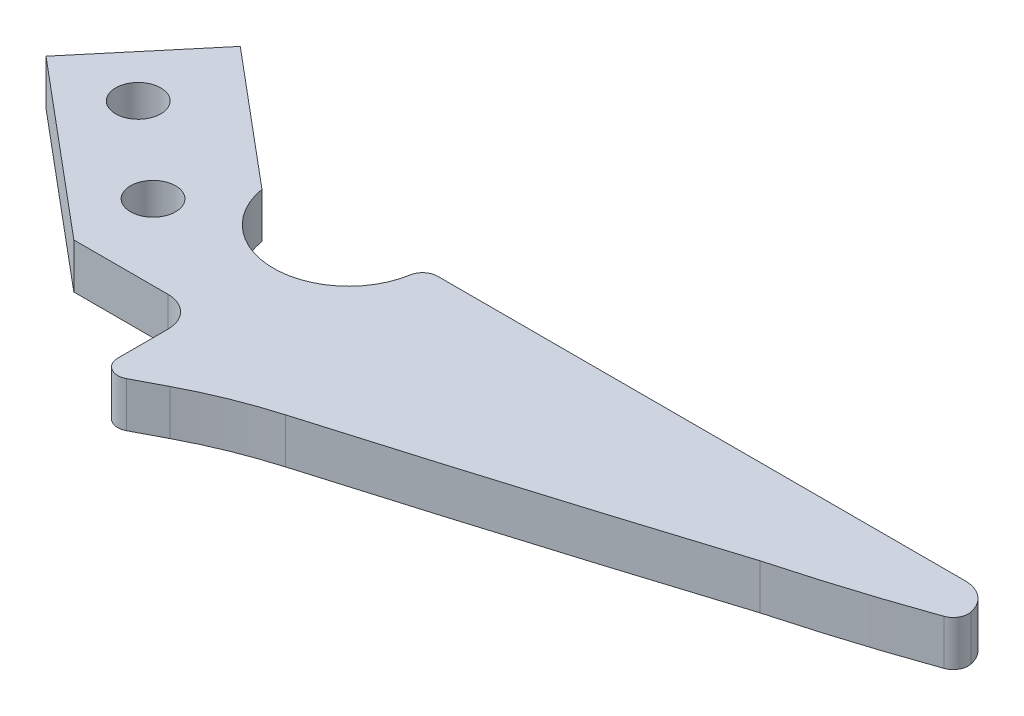
ISO-10303-21;
HEADER;
FILE_DESCRIPTION(('STEP AP214'),'2;1');
FILE_NAME('part.step','',(''),(''),'','','');
FILE_SCHEMA(('AUTOMOTIVE_DESIGN { 1 0 10303 214 1 1 1 1 }'));
ENDSEC;
DATA;
#1=APPLICATION_CONTEXT('core data for automotive mechanical design processes');
#2=APPLICATION_PROTOCOL_DEFINITION('international standard','automotive_design',2000,#1);
#3=PRODUCT_CONTEXT('',#1,'mechanical');
#4=PRODUCT('Part','Part','',(#3));
#5=PRODUCT_RELATED_PRODUCT_CATEGORY('part','',(#4));
#6=PRODUCT_DEFINITION_FORMATION('','',#4);
#7=PRODUCT_DEFINITION_CONTEXT('part definition',#1,'design');
#8=PRODUCT_DEFINITION('design','',#6,#7);
#9=PRODUCT_DEFINITION_SHAPE('','',#8);
#10=(LENGTH_UNIT() NAMED_UNIT(*) SI_UNIT(.MILLI.,.METRE.));
#11=(NAMED_UNIT(*) PLANE_ANGLE_UNIT() SI_UNIT($,.RADIAN.));
#12=(NAMED_UNIT(*) SI_UNIT($,.STERADIAN.) SOLID_ANGLE_UNIT());
#13=UNCERTAINTY_MEASURE_WITH_UNIT(LENGTH_MEASURE(1.E-05),#10,'distance_accuracy_value','');
#14=(GEOMETRIC_REPRESENTATION_CONTEXT(3) GLOBAL_UNCERTAINTY_ASSIGNED_CONTEXT((#13)) GLOBAL_UNIT_ASSIGNED_CONTEXT((#10,
#11,#12)) REPRESENTATION_CONTEXT('',''));
#15=CARTESIAN_POINT('',(0.,0.,0.));
#16=DIRECTION('',(0.,0.,1.));
#17=DIRECTION('',(1.,0.,0.));
#18=AXIS2_PLACEMENT_3D('',#15,#16,#17);
#19=CARTESIAN_POINT('',(13.,0.,5.34819795369593));
#20=DIRECTION('',(0.,1.,0.));
#21=DIRECTION('',(0.,0.,1.));
#22=AXIS2_PLACEMENT_3D('',#19,#20,#21);
#23=CYLINDRICAL_SURFACE('',#22,1.);
#24=DIRECTION('',(0.,1.,0.));
#25=VECTOR('',#24,1.);
#26=CARTESIAN_POINT('',(13.4635840631076,0.,6.23425089592493));
#27=LINE('',#26,#25);
#28=CARTESIAN_POINT('',(13.4635840631076,3.,6.23425089592493));
#29=VERTEX_POINT('',#28);
#30=CARTESIAN_POINT('',(13.4635840631076,0.,6.23425089592493));
#31=VERTEX_POINT('',#30);
#32=EDGE_CURVE('E210',#29,#31,#27,.F.);
#33=ORIENTED_EDGE('',*,*,#32,.F.);
#34=CARTESIAN_POINT('',(13.,3.,5.34819795369593));
#35=DIRECTION('',(0.,1.,0.));
#36=DIRECTION('',(0.,0.,1.));
#37=AXIS2_PLACEMENT_3D('',#34,#35,#36);
#38=CIRCLE('',#37,1.);
#39=CARTESIAN_POINT('',(12.,3.,5.34819795369593));
#40=VERTEX_POINT('',#39);
#41=EDGE_CURVE('E145',#40,#29,#38,.T.);
#42=ORIENTED_EDGE('',*,*,#41,.F.);
#43=DIRECTION('',(0.,1.,0.));
#44=VECTOR('',#43,1.);
#45=CARTESIAN_POINT('',(12.,0.,5.34819795369593));
#46=LINE('',#45,#44);
#47=CARTESIAN_POINT('',(12.,0.,5.34819795369593));
#48=VERTEX_POINT('',#47);
#49=EDGE_CURVE('E144',#48,#40,#46,.T.);
#50=ORIENTED_EDGE('',*,*,#49,.F.);
#51=CARTESIAN_POINT('',(13.,0.,5.34819795369593));
#52=DIRECTION('',(0.,1.,0.));
#53=DIRECTION('',(0.,0.,1.));
#54=AXIS2_PLACEMENT_3D('',#51,#52,#53);
#55=CIRCLE('',#54,1.);
#56=EDGE_CURVE('E20',#48,#31,#55,.T.);
#57=ORIENTED_EDGE('',*,*,#56,.T.);
#58=EDGE_LOOP('',(#33,#42,#50,#57));
#59=FACE_BOUND('',#58,.T.);
#60=ADVANCED_FACE('F17',(#59),#23,.T.);
#61=CARTESIAN_POINT('',(53.980656682762,0.,-8.19573571608667));
#62=DIRECTION('',(0.,1.,0.));
#63=DIRECTION('',(0.,0.,1.));
#64=AXIS2_PLACEMENT_3D('',#61,#62,#63);
#65=CYLINDRICAL_SURFACE('',#64,1.);
#66=CARTESIAN_POINT('',(53.980656682762,3.,-8.19573571608667));
#67=DIRECTION('',(0.,1.,0.));
#68=DIRECTION('',(0.,0.,1.));
#69=AXIS2_PLACEMENT_3D('',#66,#67,#68);
#70=CIRCLE('',#69,1.);
#71=CARTESIAN_POINT('',(54.3167919613056,3.,-7.25392200068515));
#72=VERTEX_POINT('',#71);
#73=CARTESIAN_POINT('',(54.9613133655257,3.,-8.39147143217367));
#74=VERTEX_POINT('',#73);
#75=EDGE_CURVE('E280',#72,#74,#70,.T.);
#76=ORIENTED_EDGE('',*,*,#75,.F.);
#77=DIRECTION('',(0.,1.,0.));
#78=VECTOR('',#77,1.);
#79=CARTESIAN_POINT('',(54.3167919613056,0.,-7.25392200068516));
#80=LINE('',#79,#78);
#81=CARTESIAN_POINT('',(54.3167919613056,0.,-7.25392200068515));
#82=VERTEX_POINT('',#81);
#83=EDGE_CURVE('E201',#82,#72,#80,.T.);
#84=ORIENTED_EDGE('',*,*,#83,.F.);
#85=CARTESIAN_POINT('',(53.980656682762,0.,-8.19573571608667));
#86=DIRECTION('',(0.,1.,0.));
#87=DIRECTION('',(0.,0.,1.));
#88=AXIS2_PLACEMENT_3D('',#85,#86,#87);
#89=CIRCLE('',#88,1.);
#90=CARTESIAN_POINT('',(54.9613133655257,0.,-8.39147143217367));
#91=VERTEX_POINT('',#90);
#92=EDGE_CURVE('E142',#82,#91,#89,.T.);
#93=ORIENTED_EDGE('',*,*,#92,.T.);
#94=DIRECTION('',(0.,1.,0.));
#95=VECTOR('',#94,1.);
#96=CARTESIAN_POINT('',(54.9613133655262,0.,-8.39147143217378));
#97=LINE('',#96,#95);
#98=EDGE_CURVE('E194',#74,#91,#97,.F.);
#99=ORIENTED_EDGE('',*,*,#98,.F.);
#100=EDGE_LOOP('',(#76,#84,#93,#99));
#101=FACE_BOUND('',#100,.T.);
#102=ADVANCED_FACE('F288',(#101),#65,.T.);
#103=CARTESIAN_POINT('',(17.9160797830996,0.,-9.00000000000001));
#104=DIRECTION('',(0.,1.,0.));
#105=DIRECTION('',(0.,0.,1.));
#106=AXIS2_PLACEMENT_3D('',#103,#104,#105);
#107=CYLINDRICAL_SURFACE('',#106,0.999999999999999);
#108=CARTESIAN_POINT('',(17.9160797830996,0.,-9.00000000000001));
#109=DIRECTION('',(0.,1.,0.));
#110=DIRECTION('',(0.,0.,1.));
#111=AXIS2_PLACEMENT_3D('',#108,#109,#110);
#112=CIRCLE('',#111,0.999999999999999);
#113=CARTESIAN_POINT('',(17.9160797830996,0.,-10.));
#114=VERTEX_POINT('',#113);
#115=CARTESIAN_POINT('',(16.9300664859163,0.,-9.16666666666667));
#116=VERTEX_POINT('',#115);
#117=EDGE_CURVE('E283',#114,#116,#112,.T.);
#118=ORIENTED_EDGE('',*,*,#117,.T.);
#119=DIRECTION('',(0.,1.,0.));
#120=VECTOR('',#119,1.);
#121=CARTESIAN_POINT('',(16.9300664859163,0.,-9.16666666666667));
#122=LINE('',#121,#120);
#123=CARTESIAN_POINT('',(16.9300664859163,3.,-9.16666666666667));
#124=VERTEX_POINT('',#123);
#125=EDGE_CURVE('E184',#116,#124,#122,.T.);
#126=ORIENTED_EDGE('',*,*,#125,.T.);
#127=CARTESIAN_POINT('',(17.9160797830996,3.,-9.00000000000001));
#128=DIRECTION('',(0.,1.,0.));
#129=DIRECTION('',(0.,0.,1.));
#130=AXIS2_PLACEMENT_3D('',#127,#128,#129);
#131=CIRCLE('',#130,0.999999999999999);
#132=CARTESIAN_POINT('',(17.9160797830996,3.,-10.));
#133=VERTEX_POINT('',#132);
#134=EDGE_CURVE('E277',#133,#124,#131,.T.);
#135=ORIENTED_EDGE('',*,*,#134,.F.);
#136=DIRECTION('',(0.,1.,0.));
#137=VECTOR('',#136,1.);
#138=CARTESIAN_POINT('',(17.9160797830996,0.,-10.));
#139=LINE('',#138,#137);
#140=EDGE_CURVE('E188',#114,#133,#139,.T.);
#141=ORIENTED_EDGE('',*,*,#140,.F.);
#142=EDGE_LOOP('',(#118,#126,#135,#141));
#143=FACE_BOUND('',#142,.T.);
#144=ADVANCED_FACE('F376',(#143),#107,.T.);
#145=CARTESIAN_POINT('',(12.2998821433564,3.,-124.980636425876));
#146=DIRECTION('',(0.,1.,0.));
#147=DIRECTION('',(0.,0.,1.));
#148=AXIS2_PLACEMENT_3D('',#145,#146,#147);
#149=PLANE('',#148);
#150=CARTESIAN_POINT('',(4.,3.,-5.));
#151=DIRECTION('',(0.,1.,0.));
#152=DIRECTION('',(0.,0.,1.));
#153=AXIS2_PLACEMENT_3D('',#150,#151,#152);
#154=CIRCLE('',#153,1.5);
#155=CARTESIAN_POINT('',(4.,3.,-3.5));
#156=VERTEX_POINT('',#155);
#157=EDGE_CURVE('E225',#156,#156,#154,.F.);
#158=ORIENTED_EDGE('',*,*,#157,.T.);
#159=EDGE_LOOP('',(#158));
#160=FACE_BOUND('',#159,.T.);
#161=CARTESIAN_POINT('',(12.,3.,-10.));
#162=DIRECTION('',(0.,1.,0.));
#163=DIRECTION('',(0.,0.,1.));
#164=AXIS2_PLACEMENT_3D('',#161,#162,#163);
#165=CIRCLE('',#164,5.);
#166=CARTESIAN_POINT('',(7.06993351408365,3.,-9.16666666666667));
#167=VERTEX_POINT('',#166);
#168=EDGE_CURVE('E187',#124,#167,#165,.F.);
#169=ORIENTED_EDGE('',*,*,#168,.T.);
#170=DIRECTION('',(-0.766044443118997,0.,-0.642787609686517));
#171=VECTOR('',#170,1.);
#172=CARTESIAN_POINT('',(7.06993351408365,3.,-9.16666666666667));
#173=LINE('',#172,#171);
#174=CARTESIAN_POINT('',(-1.8724279217503,3.,-16.6701988493284));
#175=VERTEX_POINT('',#174);
#176=EDGE_CURVE('E174',#175,#167,#173,.F.);
#177=ORIENTED_EDGE('',*,*,#176,.F.);
#178=DIRECTION('',(-0.642787609686517,0.,0.766044443118997));
#179=VECTOR('',#178,1.);
#180=CARTESIAN_POINT('',(-1.8724279217503,3.,-16.6701988493284));
#181=LINE('',#180,#179);
#182=CARTESIAN_POINT('',(-7.76368375617389,3.,-9.6492735437621));
#183=VERTEX_POINT('',#182);
#184=EDGE_CURVE('E181',#183,#175,#181,.F.);
#185=ORIENTED_EDGE('',*,*,#184,.F.);
#186=DIRECTION('',(-0.766044443118997,0.,-0.642787609686517));
#187=VECTOR('',#186,1.);
#188=CARTESIAN_POINT('',(3.73587265552954,3.,0.));
#189=LINE('',#188,#187);
#190=CARTESIAN_POINT('',(3.73587265552957,3.,0.));
#191=VERTEX_POINT('',#190);
#192=EDGE_CURVE('E168',#183,#191,#189,.F.);
#193=ORIENTED_EDGE('',*,*,#192,.T.);
#194=DIRECTION('',(1.,0.,0.));
#195=VECTOR('',#194,1.);
#196=CARTESIAN_POINT('',(-8.,3.,0.));
#197=LINE('',#196,#195);
#198=CARTESIAN_POINT('',(9.99999999999999,3.,0.));
#199=VERTEX_POINT('',#198);
#200=EDGE_CURVE('E217',#199,#191,#197,.F.);
#201=ORIENTED_EDGE('',*,*,#200,.F.);
#202=CARTESIAN_POINT('',(9.99999999999999,3.,2.));
#203=DIRECTION('',(0.,-1.,0.));
#204=DIRECTION('',(0.,0.,-1.));
#205=AXIS2_PLACEMENT_3D('',#202,#203,#204);
#206=CIRCLE('',#205,2.);
#207=CARTESIAN_POINT('',(12.,3.,2.));
#208=VERTEX_POINT('',#207);
#209=EDGE_CURVE('E149',#199,#208,#206,.T.);
#210=ORIENTED_EDGE('',*,*,#209,.T.);
#211=DIRECTION('',(0.,0.,1.));
#212=VECTOR('',#211,1.);
#213=CARTESIAN_POINT('',(12.,3.,0.));
#214=LINE('',#213,#212);
#215=EDGE_CURVE('E148',#40,#208,#214,.F.);
#216=ORIENTED_EDGE('',*,*,#215,.F.);
#217=ORIENTED_EDGE('',*,*,#41,.T.);
#218=DIRECTION('',(0.886052942228994,0.,-0.463584063107591));
#219=VECTOR('',#218,1.);
#220=CARTESIAN_POINT('',(12.,3.,7.));
#221=LINE('',#220,#219);
#222=CARTESIAN_POINT('',(15.3611622163812,3.,5.24143551387112));
#223=VERTEX_POINT('',#222);
#224=EDGE_CURVE('E212',#223,#29,#221,.F.);
#225=ORIENTED_EDGE('',*,*,#224,.F.);
#226=CARTESIAN_POINT('',(29.2686841096088,3.,31.8230237807408));
#227=DIRECTION('',(0.,1.,0.));
#228=DIRECTION('',(0.,0.,1.));
#229=AXIS2_PLACEMENT_3D('',#226,#227,#228);
#230=CIRCLE('',#229,30.);
#231=CARTESIAN_POINT('',(20.8237073802902,3.,3.03618011837881));
#232=VERTEX_POINT('',#231);
#233=EDGE_CURVE('E209',#223,#232,#230,.F.);
#234=ORIENTED_EDGE('',*,*,#233,.T.);
#235=CARTESIAN_POINT('',(-316.975361792386,3.,-1148.43756637586));
#236=DIRECTION('',(0.,1.,0.));
#237=DIRECTION('',(0.,0.,1.));
#238=AXIS2_PLACEMENT_3D('',#235,#236,#237);
#239=CIRCLE('',#238,1199.99999999976);
#240=CARTESIAN_POINT('',(45.0000000000018,3.,-4.33362116166966));
#241=VERTEX_POINT('',#240);
#242=EDGE_CURVE('E205',#241,#232,#239,.F.);
#243=ORIENTED_EDGE('',*,*,#242,.F.);
#244=CARTESIAN_POINT('',(12.2998821433564,3.,-124.980636425876));
#245=DIRECTION('',(0.,1.,0.));
#246=DIRECTION('',(0.,0.,1.));
#247=AXIS2_PLACEMENT_3D('',#244,#245,#246);
#248=CIRCLE('',#247,125.);
#249=EDGE_CURVE('E200',#72,#241,#248,.F.);
#250=ORIENTED_EDGE('',*,*,#249,.F.);
#251=ORIENTED_EDGE('',*,*,#75,.T.);
#252=CARTESIAN_POINT('',(53.,3.,-8.));
#253=DIRECTION('',(0.,1.,0.));
#254=DIRECTION('',(0.,0.,1.));
#255=AXIS2_PLACEMENT_3D('',#252,#253,#254);
#256=CIRCLE('',#255,2.);
#257=CARTESIAN_POINT('',(53.,3.,-10.));
#258=VERTEX_POINT('',#257);
#259=EDGE_CURVE('E197',#258,#74,#256,.F.);
#260=ORIENTED_EDGE('',*,*,#259,.F.);
#261=DIRECTION('',(-1.,0.,0.));
#262=VECTOR('',#261,1.);
#263=CARTESIAN_POINT('',(53.,3.,-10.));
#264=LINE('',#263,#262);
#265=EDGE_CURVE('E191',#133,#258,#264,.F.);
#266=ORIENTED_EDGE('',*,*,#265,.F.);
#267=ORIENTED_EDGE('',*,*,#134,.T.);
#268=EDGE_LOOP('',(#169,#177,#185,#193,#201,#210,#216,#217,#225,#234,#243,#250,#251,#260,#266,#267));
#269=FACE_BOUND('',#268,.T.);
#270=CARTESIAN_POINT('',(-2.12835554495197,3.,-10.1423008774921));
#271=DIRECTION('',(0.,-1.,0.));
#272=DIRECTION('',(0.,0.,-1.));
#273=AXIS2_PLACEMENT_3D('',#270,#271,#272);
#274=CIRCLE('',#273,1.5);
#275=CARTESIAN_POINT('',(-2.12835554495197,3.,-11.6423008774921));
#276=VERTEX_POINT('',#275);
#277=EDGE_CURVE('E274',#276,#276,#274,.T.);
#278=ORIENTED_EDGE('',*,*,#277,.T.);
#279=EDGE_LOOP('',(#278));
#280=FACE_BOUND('',#279,.T.);
#281=ADVANCED_FACE('F312',(#160,#269,#280),#149,.T.);
#282=CARTESIAN_POINT('',(-2.12835554495197,3.,-10.1423008774921));
#283=DIRECTION('',(0.,-1.,0.));
#284=DIRECTION('',(0.,0.,-1.));
#285=AXIS2_PLACEMENT_3D('',#282,#283,#284);
#286=CYLINDRICAL_SURFACE('',#285,1.5);
#287=ORIENTED_EDGE('',*,*,#277,.F.);
#288=EDGE_LOOP('',(#287));
#289=FACE_BOUND('',#288,.T.);
#290=CARTESIAN_POINT('',(-2.12835554495197,0.,-10.1423008774921));
#291=DIRECTION('',(0.,-1.,0.));
#292=DIRECTION('',(0.,0.,-1.));
#293=AXIS2_PLACEMENT_3D('',#290,#291,#292);
#294=CIRCLE('',#293,1.5);
#295=CARTESIAN_POINT('',(-2.12835554495197,0.,-11.6423008774921));
#296=VERTEX_POINT('',#295);
#297=EDGE_CURVE('E230',#296,#296,#294,.T.);
#298=ORIENTED_EDGE('',*,*,#297,.T.);
#299=EDGE_LOOP('',(#298));
#300=FACE_BOUND('',#299,.T.);
#301=ADVANCED_FACE('F384',(#289,#300),#286,.F.);
#302=CARTESIAN_POINT('',(4.,0.,-5.));
#303=DIRECTION('',(0.,1.,0.));
#304=DIRECTION('',(0.,0.,1.));
#305=AXIS2_PLACEMENT_3D('',#302,#303,#304);
#306=CYLINDRICAL_SURFACE('',#305,1.5);
#307=CARTESIAN_POINT('',(4.,0.,-5.));
#308=DIRECTION('',(0.,1.,0.));
#309=DIRECTION('',(0.,0.,1.));
#310=AXIS2_PLACEMENT_3D('',#307,#308,#309);
#311=CIRCLE('',#310,1.5);
#312=CARTESIAN_POINT('',(4.,0.,-3.5));
#313=VERTEX_POINT('',#312);
#314=EDGE_CURVE('E164',#313,#313,#311,.F.);
#315=ORIENTED_EDGE('',*,*,#314,.T.);
#316=EDGE_LOOP('',(#315));
#317=FACE_BOUND('',#316,.T.);
#318=ORIENTED_EDGE('',*,*,#157,.F.);
#319=EDGE_LOOP('',(#318));
#320=FACE_BOUND('',#319,.T.);
#321=ADVANCED_FACE('F330',(#317,#320),#306,.F.);
#322=CARTESIAN_POINT('',(-8.,0.,0.));
#323=DIRECTION('',(0.,0.,1.));
#324=DIRECTION('',(1.,0.,0.));
#325=AXIS2_PLACEMENT_3D('',#322,#323,#324);
#326=PLANE('',#325);
#327=DIRECTION('',(0.,-1.,0.));
#328=VECTOR('',#327,1.);
#329=CARTESIAN_POINT('',(9.99999999999999,0.,0.));
#330=LINE('',#329,#328);
#331=CARTESIAN_POINT('',(9.99999999999999,0.,0.));
#332=VERTEX_POINT('',#331);
#333=EDGE_CURVE('E214',#332,#199,#330,.F.);
#334=ORIENTED_EDGE('',*,*,#333,.T.);
#335=ORIENTED_EDGE('',*,*,#200,.T.);
#336=DIRECTION('',(0.,1.,0.));
#337=VECTOR('',#336,1.);
#338=CARTESIAN_POINT('',(3.73587265552956,3.,0.));
#339=LINE('',#338,#337);
#340=CARTESIAN_POINT('',(3.73587265552956,0.,0.));
#341=VERTEX_POINT('',#340);
#342=EDGE_CURVE('E169',#191,#341,#339,.F.);
#343=ORIENTED_EDGE('',*,*,#342,.T.);
#344=DIRECTION('',(1.,0.,0.));
#345=VECTOR('',#344,1.);
#346=CARTESIAN_POINT('',(12.2998821433564,0.,0.));
#347=LINE('',#346,#345);
#348=EDGE_CURVE('E158',#341,#332,#347,.T.);
#349=ORIENTED_EDGE('',*,*,#348,.T.);
#350=EDGE_LOOP('',(#334,#335,#343,#349));
#351=FACE_BOUND('',#350,.T.);
#352=ADVANCED_FACE('F317',(#351),#326,.T.);
#353=CARTESIAN_POINT('',(9.99999999999999,0.,2.));
#354=DIRECTION('',(0.,-1.,0.));
#355=DIRECTION('',(0.,0.,-1.));
#356=AXIS2_PLACEMENT_3D('',#353,#354,#355);
#357=CYLINDRICAL_SURFACE('',#356,2.);
#358=DIRECTION('',(0.,1.,0.));
#359=VECTOR('',#358,1.);
#360=CARTESIAN_POINT('',(12.,0.,2.));
#361=LINE('',#360,#359);
#362=CARTESIAN_POINT('',(12.,0.,2.));
#363=VERTEX_POINT('',#362);
#364=EDGE_CURVE('E153',#208,#363,#361,.F.);
#365=ORIENTED_EDGE('',*,*,#364,.F.);
#366=ORIENTED_EDGE('',*,*,#209,.F.);
#367=ORIENTED_EDGE('',*,*,#333,.F.);
#368=CARTESIAN_POINT('',(9.99999999999999,0.,2.));
#369=DIRECTION('',(0.,-1.,0.));
#370=DIRECTION('',(0.,0.,-1.));
#371=AXIS2_PLACEMENT_3D('',#368,#369,#370);
#372=CIRCLE('',#371,2.);
#373=EDGE_CURVE('E154',#332,#363,#372,.T.);
#374=ORIENTED_EDGE('',*,*,#373,.T.);
#375=EDGE_LOOP('',(#365,#366,#367,#374));
#376=FACE_BOUND('',#375,.T.);
#377=ADVANCED_FACE('F320',(#376),#357,.F.);
#378=CARTESIAN_POINT('',(12.,0.,0.));
#379=DIRECTION('',(-1.,0.,0.));
#380=DIRECTION('',(0.,0.,1.));
#381=AXIS2_PLACEMENT_3D('',#378,#379,#380);
#382=PLANE('',#381);
#383=ORIENTED_EDGE('',*,*,#215,.T.);
#384=ORIENTED_EDGE('',*,*,#364,.T.);
#385=DIRECTION('',(0.,0.,1.));
#386=VECTOR('',#385,1.);
#387=CARTESIAN_POINT('',(12.,0.,-124.980636425876));
#388=LINE('',#387,#386);
#389=EDGE_CURVE('E137',#363,#48,#388,.T.);
#390=ORIENTED_EDGE('',*,*,#389,.T.);
#391=ORIENTED_EDGE('',*,*,#49,.T.);
#392=EDGE_LOOP('',(#383,#384,#390,#391));
#393=FACE_BOUND('',#392,.T.);
#394=ADVANCED_FACE('F151',(#393),#382,.T.);
#395=CARTESIAN_POINT('',(12.,0.,7.));
#396=DIRECTION('',(0.463584063107591,0.,0.886052942228994));
#397=DIRECTION('',(0.886052942228994,0.,-0.463584063107591));
#398=AXIS2_PLACEMENT_3D('',#395,#396,#397);
#399=PLANE('',#398);
#400=ORIENTED_EDGE('',*,*,#224,.T.);
#401=ORIENTED_EDGE('',*,*,#32,.T.);
#402=DIRECTION('',(0.886052942228991,0.,-0.463584063107598));
#403=VECTOR('',#402,1.);
#404=CARTESIAN_POINT('',(13.4635840631076,0.,6.23425089592494));
#405=LINE('',#404,#403);
#406=CARTESIAN_POINT('',(15.3611622163811,0.,5.24143551387117));
#407=VERTEX_POINT('',#406);
#408=EDGE_CURVE('E141',#31,#407,#405,.T.);
#409=ORIENTED_EDGE('',*,*,#408,.T.);
#410=DIRECTION('',(0.,1.,0.));
#411=VECTOR('',#410,1.);
#412=CARTESIAN_POINT('',(15.3611622163811,0.,5.24143551387094));
#413=LINE('',#412,#411);
#414=EDGE_CURVE('E206',#407,#223,#413,.T.);
#415=ORIENTED_EDGE('',*,*,#414,.T.);
#416=EDGE_LOOP('',(#400,#401,#409,#415));
#417=FACE_BOUND('',#416,.T.);
#418=ADVANCED_FACE('F328',(#417),#399,.T.);
#419=CARTESIAN_POINT('',(29.2686841096088,0.,31.8230237807408));
#420=DIRECTION('',(0.,1.,0.));
#421=DIRECTION('',(0.,0.,1.));
#422=AXIS2_PLACEMENT_3D('',#419,#420,#421);
#423=CYLINDRICAL_SURFACE('',#422,30.);
#424=DIRECTION('',(0.,1.,0.));
#425=VECTOR('',#424,1.);
#426=CARTESIAN_POINT('',(20.8237073802902,0.,3.0361801183787));
#427=LINE('',#426,#425);
#428=CARTESIAN_POINT('',(20.8237073802902,0.,3.03618011837881));
#429=VERTEX_POINT('',#428);
#430=EDGE_CURVE('E203',#232,#429,#427,.F.);
#431=ORIENTED_EDGE('',*,*,#430,.F.);
#432=ORIENTED_EDGE('',*,*,#233,.F.);
#433=ORIENTED_EDGE('',*,*,#414,.F.);
#434=CARTESIAN_POINT('',(29.2686841096088,0.,31.8230237807408));
#435=DIRECTION('',(0.,1.,0.));
#436=DIRECTION('',(0.,0.,1.));
#437=AXIS2_PLACEMENT_3D('',#434,#435,#436);
#438=CIRCLE('',#437,30.);
#439=EDGE_CURVE('E156',#407,#429,#438,.F.);
#440=ORIENTED_EDGE('',*,*,#439,.T.);
#441=EDGE_LOOP('',(#431,#432,#433,#440));
#442=FACE_BOUND('',#441,.T.);
#443=ADVANCED_FACE('F359',(#442),#423,.F.);
#444=CARTESIAN_POINT('',(-316.975361792386,0.,-1148.43756637586));
#445=DIRECTION('',(0.,1.,0.));
#446=DIRECTION('',(0.,0.,1.));
#447=AXIS2_PLACEMENT_3D('',#444,#445,#446);
#448=CYLINDRICAL_SURFACE('',#447,1199.99999999976);
#449=CARTESIAN_POINT('',(-316.975361792386,0.,-1148.43756637586));
#450=DIRECTION('',(0.,1.,0.));
#451=DIRECTION('',(0.,0.,1.));
#452=AXIS2_PLACEMENT_3D('',#449,#450,#451);
#453=CIRCLE('',#452,1199.99999999976);
#454=CARTESIAN_POINT('',(45.0000000000018,0.,-4.33362116166966));
#455=VERTEX_POINT('',#454);
#456=EDGE_CURVE('E253',#429,#455,#453,.T.);
#457=ORIENTED_EDGE('',*,*,#456,.T.);
#458=DIRECTION('',(0.,1.,0.));
#459=VECTOR('',#458,1.);
#460=CARTESIAN_POINT('',(45.,0.,-4.33362116166924));
#461=LINE('',#460,#459);
#462=EDGE_CURVE('E198',#241,#455,#461,.F.);
#463=ORIENTED_EDGE('',*,*,#462,.F.);
#464=ORIENTED_EDGE('',*,*,#242,.T.);
#465=ORIENTED_EDGE('',*,*,#430,.T.);
#466=EDGE_LOOP('',(#457,#463,#464,#465));
#467=FACE_BOUND('',#466,.T.);
#468=ADVANCED_FACE('F355',(#467),#448,.T.);
#469=CARTESIAN_POINT('',(12.2998821433564,0.,-124.980636425876));
#470=DIRECTION('',(0.,1.,0.));
#471=DIRECTION('',(0.,0.,1.));
#472=AXIS2_PLACEMENT_3D('',#469,#470,#471);
#473=CYLINDRICAL_SURFACE('',#472,125.);
#474=ORIENTED_EDGE('',*,*,#249,.T.);
#475=ORIENTED_EDGE('',*,*,#462,.T.);
#476=CARTESIAN_POINT('',(12.2998821433564,0.,-124.980636425876));
#477=DIRECTION('',(0.,1.,0.));
#478=DIRECTION('',(0.,0.,1.));
#479=AXIS2_PLACEMENT_3D('',#476,#477,#478);
#480=CIRCLE('',#479,125.);
#481=EDGE_CURVE('E250',#455,#82,#480,.T.);
#482=ORIENTED_EDGE('',*,*,#481,.T.);
#483=ORIENTED_EDGE('',*,*,#83,.T.);
#484=EDGE_LOOP('',(#474,#475,#482,#483));
#485=FACE_BOUND('',#484,.T.);
#486=ADVANCED_FACE('F352',(#485),#473,.T.);
#487=CARTESIAN_POINT('',(53.,0.,-8.));
#488=DIRECTION('',(0.,1.,0.));
#489=DIRECTION('',(0.,0.,1.));
#490=AXIS2_PLACEMENT_3D('',#487,#488,#489);
#491=CYLINDRICAL_SURFACE('',#490,2.);
#492=CARTESIAN_POINT('',(53.,0.,-8.));
#493=DIRECTION('',(0.,1.,0.));
#494=DIRECTION('',(0.,0.,1.));
#495=AXIS2_PLACEMENT_3D('',#492,#493,#494);
#496=CIRCLE('',#495,2.);
#497=CARTESIAN_POINT('',(53.,0.,-10.));
#498=VERTEX_POINT('',#497);
#499=EDGE_CURVE('E247',#91,#498,#496,.T.);
#500=ORIENTED_EDGE('',*,*,#499,.T.);
#501=DIRECTION('',(0.,1.,0.));
#502=VECTOR('',#501,1.);
#503=CARTESIAN_POINT('',(53.,0.,-10.));
#504=LINE('',#503,#502);
#505=EDGE_CURVE('E189',#258,#498,#504,.F.);
#506=ORIENTED_EDGE('',*,*,#505,.F.);
#507=ORIENTED_EDGE('',*,*,#259,.T.);
#508=ORIENTED_EDGE('',*,*,#98,.T.);
#509=EDGE_LOOP('',(#500,#506,#507,#508));
#510=FACE_BOUND('',#509,.T.);
#511=ADVANCED_FACE('F292',(#510),#491,.T.);
#512=CARTESIAN_POINT('',(53.,0.,-10.));
#513=DIRECTION('',(0.,0.,-1.));
#514=DIRECTION('',(-1.,0.,0.));
#515=AXIS2_PLACEMENT_3D('',#512,#513,#514);
#516=PLANE('',#515);
#517=DIRECTION('',(1.,0.,0.));
#518=VECTOR('',#517,1.);
#519=CARTESIAN_POINT('',(12.2998821433564,0.,-9.99999999999999));
#520=LINE('',#519,#518);
#521=EDGE_CURVE('E246',#498,#114,#520,.F.);
#522=ORIENTED_EDGE('',*,*,#521,.T.);
#523=ORIENTED_EDGE('',*,*,#140,.T.);
#524=ORIENTED_EDGE('',*,*,#265,.T.);
#525=ORIENTED_EDGE('',*,*,#505,.T.);
#526=EDGE_LOOP('',(#522,#523,#524,#525));
#527=FACE_BOUND('',#526,.T.);
#528=ADVANCED_FACE('F346',(#527),#516,.T.);
#529=CARTESIAN_POINT('',(12.,0.,-10.));
#530=DIRECTION('',(0.,1.,0.));
#531=DIRECTION('',(0.,0.,1.));
#532=AXIS2_PLACEMENT_3D('',#529,#530,#531);
#533=CYLINDRICAL_SURFACE('',#532,5.);
#534=CARTESIAN_POINT('',(12.,0.,-10.));
#535=DIRECTION('',(0.,1.,0.));
#536=DIRECTION('',(0.,0.,1.));
#537=AXIS2_PLACEMENT_3D('',#534,#535,#536);
#538=CIRCLE('',#537,5.);
#539=CARTESIAN_POINT('',(7.06993351408365,0.,-9.16666666666667));
#540=VERTEX_POINT('',#539);
#541=EDGE_CURVE('E244',#116,#540,#538,.F.);
#542=ORIENTED_EDGE('',*,*,#541,.T.);
#543=DIRECTION('',(0.,1.,0.));
#544=VECTOR('',#543,1.);
#545=CARTESIAN_POINT('',(7.06993351408365,3.,-9.16666666666667));
#546=LINE('',#545,#544);
#547=EDGE_CURVE('E170',#167,#540,#546,.F.);
#548=ORIENTED_EDGE('',*,*,#547,.F.);
#549=ORIENTED_EDGE('',*,*,#168,.F.);
#550=ORIENTED_EDGE('',*,*,#125,.F.);
#551=EDGE_LOOP('',(#542,#548,#549,#550));
#552=FACE_BOUND('',#551,.T.);
#553=ADVANCED_FACE('F343',(#552),#533,.F.);
#554=CARTESIAN_POINT('',(7.06993351408365,3.,-9.16666666666667));
#555=DIRECTION('',(0.642787609686517,0.,-0.766044443118997));
#556=DIRECTION('',(-0.766044443118997,0.,-0.642787609686517));
#557=AXIS2_PLACEMENT_3D('',#554,#555,#556);
#558=PLANE('',#557);
#559=DIRECTION('',(-0.766044443118997,0.,-0.642787609686517));
#560=VECTOR('',#559,1.);
#561=CARTESIAN_POINT('',(7.06993351408365,0.,-9.16666666666667));
#562=LINE('',#561,#560);
#563=CARTESIAN_POINT('',(-1.8724279217503,0.,-16.6701988493284));
#564=VERTEX_POINT('',#563);
#565=EDGE_CURVE('E177',#540,#564,#562,.T.);
#566=ORIENTED_EDGE('',*,*,#565,.T.);
#567=DIRECTION('',(0.,1.,0.));
#568=VECTOR('',#567,1.);
#569=CARTESIAN_POINT('',(-1.8724279217503,3.,-16.6701988493284));
#570=LINE('',#569,#568);
#571=EDGE_CURVE('E173',#175,#564,#570,.F.);
#572=ORIENTED_EDGE('',*,*,#571,.F.);
#573=ORIENTED_EDGE('',*,*,#176,.T.);
#574=ORIENTED_EDGE('',*,*,#547,.T.);
#575=EDGE_LOOP('',(#566,#572,#573,#574));
#576=FACE_BOUND('',#575,.T.);
#577=ADVANCED_FACE('F307',(#576),#558,.T.);
#578=CARTESIAN_POINT('',(-1.8724279217503,3.,-16.6701988493284));
#579=DIRECTION('',(-0.766044443118997,0.,-0.642787609686517));
#580=DIRECTION('',(-0.642787609686517,0.,0.766044443118997));
#581=AXIS2_PLACEMENT_3D('',#578,#579,#580);
#582=PLANE('',#581);
#583=DIRECTION('',(0.,1.,0.));
#584=VECTOR('',#583,1.);
#585=CARTESIAN_POINT('',(-7.76368375617389,3.,-9.6492735437621));
#586=LINE('',#585,#584);
#587=CARTESIAN_POINT('',(-7.76368375617389,0.,-9.6492735437621));
#588=VERTEX_POINT('',#587);
#589=EDGE_CURVE('E34',#588,#183,#586,.T.);
#590=ORIENTED_EDGE('',*,*,#589,.T.);
#591=ORIENTED_EDGE('',*,*,#184,.T.);
#592=ORIENTED_EDGE('',*,*,#571,.T.);
#593=DIRECTION('',(-0.642787609686518,0.,0.766044443118996));
#594=VECTOR('',#593,1.);
#595=CARTESIAN_POINT('',(-1.8724279217503,0.,-16.6701988493284));
#596=LINE('',#595,#594);
#597=EDGE_CURVE('E26',#564,#588,#596,.T.);
#598=ORIENTED_EDGE('',*,*,#597,.T.);
#599=EDGE_LOOP('',(#590,#591,#592,#598));
#600=FACE_BOUND('',#599,.T.);
#601=ADVANCED_FACE('F310',(#600),#582,.T.);
#602=CARTESIAN_POINT('',(3.73587265552954,3.,0.));
#603=DIRECTION('',(0.642787609686517,0.,-0.766044443118997));
#604=DIRECTION('',(-0.766044443118997,0.,-0.642787609686517));
#605=AXIS2_PLACEMENT_3D('',#602,#603,#604);
#606=PLANE('',#605);
#607=ORIENTED_EDGE('',*,*,#589,.F.);
#608=DIRECTION('',(0.766044443118997,0.,0.642787609686517));
#609=VECTOR('',#608,1.);
#610=CARTESIAN_POINT('',(-7.76368375617389,0.,-9.6492735437621));
#611=LINE('',#610,#609);
#612=EDGE_CURVE('E11',#588,#341,#611,.T.);
#613=ORIENTED_EDGE('',*,*,#612,.T.);
#614=ORIENTED_EDGE('',*,*,#342,.F.);
#615=ORIENTED_EDGE('',*,*,#192,.F.);
#616=EDGE_LOOP('',(#607,#613,#614,#615));
#617=FACE_BOUND('',#616,.T.);
#618=ADVANCED_FACE('F315',(#617),#606,.F.);
#619=CARTESIAN_POINT('',(12.2998821433564,0.,-124.980636425876));
#620=DIRECTION('',(0.,1.,0.));
#621=DIRECTION('',(0.,0.,1.));
#622=AXIS2_PLACEMENT_3D('',#619,#620,#621);
#623=PLANE('',#622);
#624=ORIENTED_EDGE('',*,*,#597,.F.);
#625=ORIENTED_EDGE('',*,*,#565,.F.);
#626=ORIENTED_EDGE('',*,*,#541,.F.);
#627=ORIENTED_EDGE('',*,*,#117,.F.);
#628=ORIENTED_EDGE('',*,*,#521,.F.);
#629=ORIENTED_EDGE('',*,*,#499,.F.);
#630=ORIENTED_EDGE('',*,*,#92,.F.);
#631=ORIENTED_EDGE('',*,*,#481,.F.);
#632=ORIENTED_EDGE('',*,*,#456,.F.);
#633=ORIENTED_EDGE('',*,*,#439,.F.);
#634=ORIENTED_EDGE('',*,*,#408,.F.);
#635=ORIENTED_EDGE('',*,*,#56,.F.);
#636=ORIENTED_EDGE('',*,*,#389,.F.);
#637=ORIENTED_EDGE('',*,*,#373,.F.);
#638=ORIENTED_EDGE('',*,*,#348,.F.);
#639=ORIENTED_EDGE('',*,*,#612,.F.);
#640=EDGE_LOOP('',(#624,#625,#626,#627,#628,#629,#630,#631,#632,#633,#634,#635,#636,#637,#638,#639));
#641=FACE_BOUND('',#640,.T.);
#642=ORIENTED_EDGE('',*,*,#314,.F.);
#643=EDGE_LOOP('',(#642));
#644=FACE_BOUND('',#643,.T.);
#645=ORIENTED_EDGE('',*,*,#297,.F.);
#646=EDGE_LOOP('',(#645));
#647=FACE_BOUND('',#646,.T.);
#648=ADVANCED_FACE('F133',(#641,#644,#647),#623,.F.);
#649=CLOSED_SHELL('',(#60,#102,#144,#281,#301,#321,#352,#377,#394,#418,#443,#468,#486,#511,#528,
#553,#577,#601,#618,#648));
#650=MANIFOLD_SOLID_BREP('B1',#649);
#651=ADVANCED_BREP_SHAPE_REPRESENTATION('',(#18,#650),#14);
#652=SHAPE_DEFINITION_REPRESENTATION(#9,#651);
ENDSEC;
END-ISO-10303-21;
